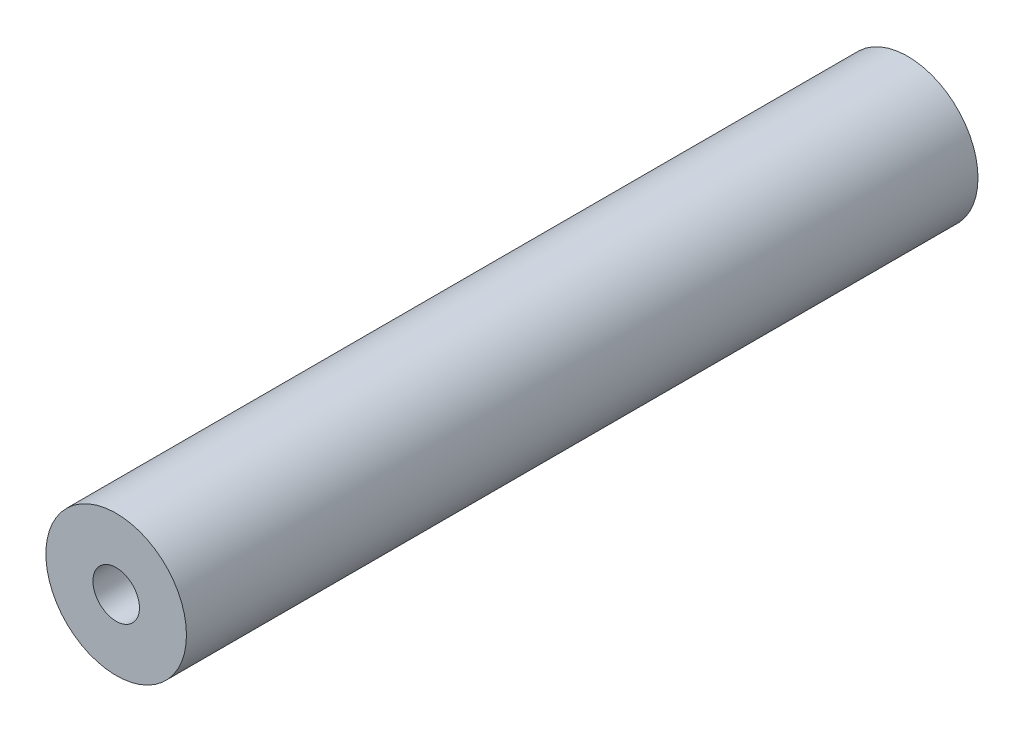
ISO-10303-21;
HEADER;
FILE_DESCRIPTION(('STEP AP214'),'2;1');
FILE_NAME('part.step','',(''),(''),'','','');
FILE_SCHEMA(('AUTOMOTIVE_DESIGN { 1 0 10303 214 1 1 1 1 }'));
ENDSEC;
DATA;
#1=APPLICATION_CONTEXT('core data for automotive mechanical design processes');
#2=APPLICATION_PROTOCOL_DEFINITION('international standard','automotive_design',2000,#1);
#3=PRODUCT_CONTEXT('',#1,'mechanical');
#4=PRODUCT('Part','Part','',(#3));
#5=PRODUCT_RELATED_PRODUCT_CATEGORY('part','',(#4));
#6=PRODUCT_DEFINITION_FORMATION('','',#4);
#7=PRODUCT_DEFINITION_CONTEXT('part definition',#1,'design');
#8=PRODUCT_DEFINITION('design','',#6,#7);
#9=PRODUCT_DEFINITION_SHAPE('','',#8);
#10=(LENGTH_UNIT() NAMED_UNIT(*) SI_UNIT(.MILLI.,.METRE.));
#11=(NAMED_UNIT(*) PLANE_ANGLE_UNIT() SI_UNIT($,.RADIAN.));
#12=(NAMED_UNIT(*) SI_UNIT($,.STERADIAN.) SOLID_ANGLE_UNIT());
#13=UNCERTAINTY_MEASURE_WITH_UNIT(LENGTH_MEASURE(1.E-05),#10,'distance_accuracy_value','');
#14=(GEOMETRIC_REPRESENTATION_CONTEXT(3) GLOBAL_UNCERTAINTY_ASSIGNED_CONTEXT((#13)) GLOBAL_UNIT_ASSIGNED_CONTEXT((#10,
#11,#12)) REPRESENTATION_CONTEXT('',''));
#15=CARTESIAN_POINT('',(0.,0.,0.));
#16=DIRECTION('',(0.,0.,1.));
#17=DIRECTION('',(1.,0.,0.));
#18=AXIS2_PLACEMENT_3D('',#15,#16,#17);
#19=CARTESIAN_POINT('',(0.,0.,-71.5));
#20=DIRECTION('',(0.,0.,1.));
#21=DIRECTION('',(1.,0.,0.));
#22=AXIS2_PLACEMENT_3D('',#19,#20,#21);
#23=CYLINDRICAL_SURFACE('',#22,6.35);
#24=CARTESIAN_POINT('',(0.,0.,-71.5));
#25=DIRECTION('',(0.,0.,1.));
#26=DIRECTION('',(1.,0.,0.));
#27=AXIS2_PLACEMENT_3D('',#24,#25,#26);
#28=CIRCLE('',#27,6.35);
#29=CARTESIAN_POINT('',(6.35,0.,-71.5));
#30=VERTEX_POINT('',#29);
#31=EDGE_CURVE('E10',#30,#30,#28,.T.);
#32=ORIENTED_EDGE('',*,*,#31,.T.);
#33=EDGE_LOOP('',(#32));
#34=FACE_BOUND('',#33,.T.);
#35=CARTESIAN_POINT('',(0.,0.,0.));
#36=DIRECTION('',(0.,0.,1.));
#37=DIRECTION('',(1.,0.,0.));
#38=AXIS2_PLACEMENT_3D('',#35,#36,#37);
#39=CIRCLE('',#38,6.35);
#40=CARTESIAN_POINT('',(6.35,0.,0.));
#41=VERTEX_POINT('',#40);
#42=EDGE_CURVE('E34',#41,#41,#39,.T.);
#43=ORIENTED_EDGE('',*,*,#42,.F.);
#44=EDGE_LOOP('',(#43));
#45=FACE_BOUND('',#44,.T.);
#46=ADVANCED_FACE('F31',(#34,#45),#23,.T.);
#47=CARTESIAN_POINT('',(0.,0.,-71.5));
#48=DIRECTION('',(0.,0.,1.));
#49=DIRECTION('',(1.,0.,0.));
#50=AXIS2_PLACEMENT_3D('',#47,#48,#49);
#51=PLANE('',#50);
#52=ORIENTED_EDGE('',*,*,#31,.F.);
#53=EDGE_LOOP('',(#52));
#54=FACE_BOUND('',#53,.T.);
#55=ADVANCED_FACE('F60',(#54),#51,.F.);
#56=CARTESIAN_POINT('',(0.,0.,0.));
#57=DIRECTION('',(0.,0.,1.));
#58=DIRECTION('',(1.,0.,0.));
#59=AXIS2_PLACEMENT_3D('',#56,#57,#58);
#60=PLANE('',#59);
#61=CARTESIAN_POINT('',(0.,0.,0.));
#62=DIRECTION('',(0.,0.,1.));
#63=DIRECTION('',(1.,0.,0.));
#64=AXIS2_PLACEMENT_3D('',#61,#62,#63);
#65=CIRCLE('',#64,2.1);
#66=CARTESIAN_POINT('',(2.1,0.,0.));
#67=VERTEX_POINT('',#66);
#68=EDGE_CURVE('E43',#67,#67,#65,.T.);
#69=ORIENTED_EDGE('',*,*,#68,.F.);
#70=EDGE_LOOP('',(#69));
#71=FACE_BOUND('',#70,.T.);
#72=ORIENTED_EDGE('',*,*,#42,.T.);
#73=EDGE_LOOP('',(#72));
#74=FACE_BOUND('',#73,.T.);
#75=ADVANCED_FACE('F54',(#71,#74),#60,.T.);
#76=CARTESIAN_POINT('',(0.,0.,-15.));
#77=DIRECTION('',(0.,0.,1.));
#78=DIRECTION('',(1.,0.,0.));
#79=AXIS2_PLACEMENT_3D('',#76,#77,#78);
#80=CYLINDRICAL_SURFACE('',#79,2.1);
#81=CARTESIAN_POINT('',(0.,0.,-15.));
#82=DIRECTION('',(0.,0.,1.));
#83=DIRECTION('',(1.,0.,0.));
#84=AXIS2_PLACEMENT_3D('',#81,#82,#83);
#85=CIRCLE('',#84,2.1);
#86=CARTESIAN_POINT('',(2.1,0.,-15.));
#87=VERTEX_POINT('',#86);
#88=EDGE_CURVE('E41',#87,#87,#85,.T.);
#89=ORIENTED_EDGE('',*,*,#88,.F.);
#90=EDGE_LOOP('',(#89));
#91=FACE_BOUND('',#90,.T.);
#92=ORIENTED_EDGE('',*,*,#68,.T.);
#93=EDGE_LOOP('',(#92));
#94=FACE_BOUND('',#93,.T.);
#95=ADVANCED_FACE('F51',(#91,#94),#80,.F.);
#96=CARTESIAN_POINT('',(0.,0.,-15.));
#97=DIRECTION('',(0.,0.,1.));
#98=DIRECTION('',(1.,0.,0.));
#99=AXIS2_PLACEMENT_3D('',#96,#97,#98);
#100=PLANE('',#99);
#101=ORIENTED_EDGE('',*,*,#88,.T.);
#102=EDGE_LOOP('',(#101));
#103=FACE_BOUND('',#102,.T.);
#104=ADVANCED_FACE('F49',(#103),#100,.T.);
#105=CLOSED_SHELL('',(#46,#55,#75,#95,#104));
#106=MANIFOLD_SOLID_BREP('B2',#105);
#107=ADVANCED_BREP_SHAPE_REPRESENTATION('',(#18,#106),#14);
#108=SHAPE_DEFINITION_REPRESENTATION(#9,#107);
ENDSEC;
END-ISO-10303-21;
